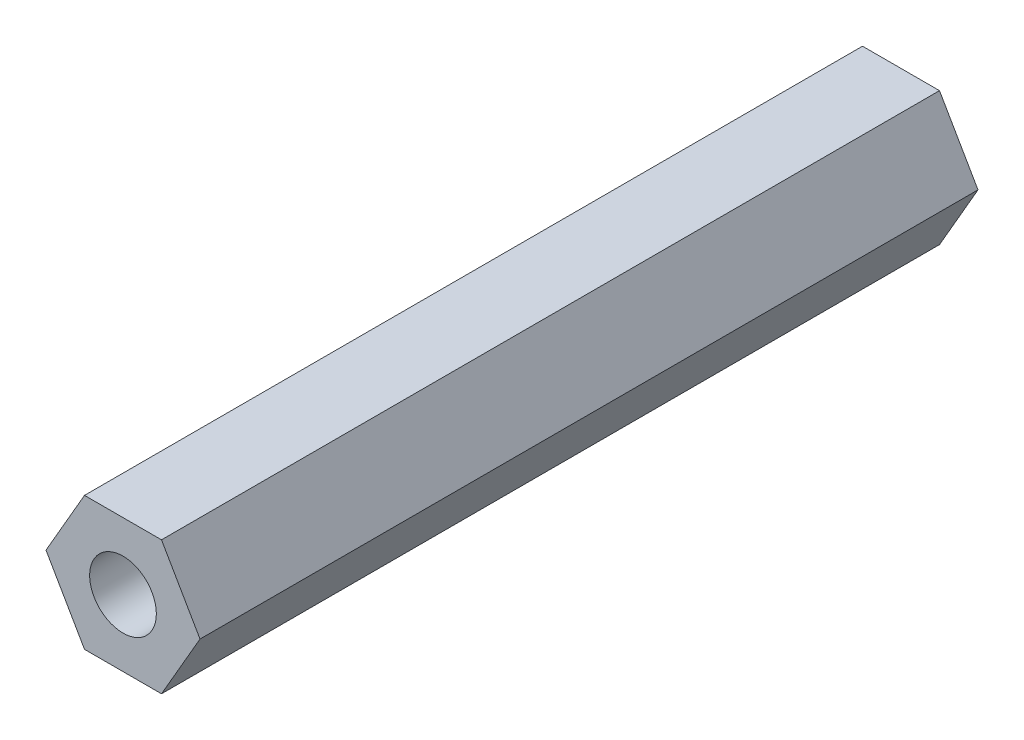
ISO-10303-21;
HEADER;
FILE_DESCRIPTION(('STEP AP214'),'2;1');
FILE_NAME('part.step','',(''),(''),'','','');
FILE_SCHEMA(('AUTOMOTIVE_DESIGN { 1 0 10303 214 1 1 1 1 }'));
ENDSEC;
DATA;
#1=APPLICATION_CONTEXT('core data for automotive mechanical design processes');
#2=APPLICATION_PROTOCOL_DEFINITION('international standard','automotive_design',2000,#1);
#3=PRODUCT_CONTEXT('',#1,'mechanical');
#4=PRODUCT('Part','Part','',(#3));
#5=PRODUCT_RELATED_PRODUCT_CATEGORY('part','',(#4));
#6=PRODUCT_DEFINITION_FORMATION('','',#4);
#7=PRODUCT_DEFINITION_CONTEXT('part definition',#1,'design');
#8=PRODUCT_DEFINITION('design','',#6,#7);
#9=PRODUCT_DEFINITION_SHAPE('','',#8);
#10=(LENGTH_UNIT() NAMED_UNIT(*) SI_UNIT(.MILLI.,.METRE.));
#11=(NAMED_UNIT(*) PLANE_ANGLE_UNIT() SI_UNIT($,.RADIAN.));
#12=(NAMED_UNIT(*) SI_UNIT($,.STERADIAN.) SOLID_ANGLE_UNIT());
#13=UNCERTAINTY_MEASURE_WITH_UNIT(LENGTH_MEASURE(1.E-05),#10,'distance_accuracy_value','');
#14=(GEOMETRIC_REPRESENTATION_CONTEXT(3) GLOBAL_UNCERTAINTY_ASSIGNED_CONTEXT((#13)) GLOBAL_UNIT_ASSIGNED_CONTEXT((#10,
#11,#12)) REPRESENTATION_CONTEXT('',''));
#15=CARTESIAN_POINT('',(0.,0.,0.));
#16=DIRECTION('',(0.,0.,1.));
#17=DIRECTION('',(1.,0.,0.));
#18=AXIS2_PLACEMENT_3D('',#15,#16,#17);
#19=CARTESIAN_POINT('',(-1.73205080756888,-3.,35.));
#20=DIRECTION('',(0.866025403784439,-0.5,0.));
#21=DIRECTION('',(0.5,0.866025403784439,0.));
#22=AXIS2_PLACEMENT_3D('',#19,#20,#21);
#23=PLANE('',#22);
#24=DIRECTION('',(-0.5,-0.866025403784439,0.));
#25=VECTOR('',#24,1.);
#26=CARTESIAN_POINT('',(-1.73205080756888,-3.,0.));
#27=LINE('',#26,#25);
#28=CARTESIAN_POINT('',(0.,0.,0.));
#29=VERTEX_POINT('',#28);
#30=CARTESIAN_POINT('',(-1.73205080756888,-3.,0.));
#31=VERTEX_POINT('',#30);
#32=EDGE_CURVE('E118',#29,#31,#27,.T.);
#33=ORIENTED_EDGE('',*,*,#32,.T.);
#34=DIRECTION('',(0.,0.,-1.));
#35=VECTOR('',#34,1.);
#36=CARTESIAN_POINT('',(-1.73205080756888,-3.,35.));
#37=LINE('',#36,#35);
#38=CARTESIAN_POINT('',(-1.73205080756888,-3.,35.));
#39=VERTEX_POINT('',#38);
#40=EDGE_CURVE('E11',#39,#31,#37,.T.);
#41=ORIENTED_EDGE('',*,*,#40,.F.);
#42=DIRECTION('',(-0.5,-0.866025403784439,0.));
#43=VECTOR('',#42,1.);
#44=CARTESIAN_POINT('',(-1.73205080756888,-3.,35.));
#45=LINE('',#44,#43);
#46=CARTESIAN_POINT('',(0.,0.,35.));
#47=VERTEX_POINT('',#46);
#48=EDGE_CURVE('E129',#47,#39,#45,.T.);
#49=ORIENTED_EDGE('',*,*,#48,.F.);
#50=DIRECTION('',(0.,0.,-1.));
#51=VECTOR('',#50,1.);
#52=CARTESIAN_POINT('',(0.,0.,35.));
#53=LINE('',#52,#51);
#54=EDGE_CURVE('E114',#47,#29,#53,.T.);
#55=ORIENTED_EDGE('',*,*,#54,.T.);
#56=EDGE_LOOP('',(#33,#41,#49,#55));
#57=FACE_BOUND('',#56,.T.);
#58=ADVANCED_FACE('F34',(#57),#23,.F.);
#59=CARTESIAN_POINT('',(0.,-6.,35.));
#60=DIRECTION('',(0.866025403784439,0.5,0.));
#61=DIRECTION('',(-0.5,0.866025403784439,0.));
#62=AXIS2_PLACEMENT_3D('',#59,#60,#61);
#63=PLANE('',#62);
#64=DIRECTION('',(0.5,-0.866025403784439,0.));
#65=VECTOR('',#64,1.);
#66=CARTESIAN_POINT('',(0.,-6.,0.));
#67=LINE('',#66,#65);
#68=CARTESIAN_POINT('',(0.,-6.,0.));
#69=VERTEX_POINT('',#68);
#70=EDGE_CURVE('E121',#31,#69,#67,.T.);
#71=ORIENTED_EDGE('',*,*,#70,.T.);
#72=DIRECTION('',(0.,0.,-1.));
#73=VECTOR('',#72,1.);
#74=CARTESIAN_POINT('',(0.,-6.,35.));
#75=LINE('',#74,#73);
#76=CARTESIAN_POINT('',(0.,-6.,35.));
#77=VERTEX_POINT('',#76);
#78=EDGE_CURVE('E42',#77,#69,#75,.T.);
#79=ORIENTED_EDGE('',*,*,#78,.F.);
#80=DIRECTION('',(0.5,-0.866025403784439,0.));
#81=VECTOR('',#80,1.);
#82=CARTESIAN_POINT('',(0.,-6.,35.));
#83=LINE('',#82,#81);
#84=EDGE_CURVE('E87',#39,#77,#83,.T.);
#85=ORIENTED_EDGE('',*,*,#84,.F.);
#86=ORIENTED_EDGE('',*,*,#40,.T.);
#87=EDGE_LOOP('',(#71,#79,#85,#86));
#88=FACE_BOUND('',#87,.T.);
#89=ADVANCED_FACE('F154',(#88),#63,.F.);
#90=CARTESIAN_POINT('',(3.46410161513775,-6.,35.));
#91=DIRECTION('',(0.,1.,0.));
#92=DIRECTION('',(0.,0.,1.));
#93=AXIS2_PLACEMENT_3D('',#90,#91,#92);
#94=PLANE('',#93);
#95=DIRECTION('',(1.,0.,0.));
#96=VECTOR('',#95,1.);
#97=CARTESIAN_POINT('',(3.46410161513775,-6.,0.));
#98=LINE('',#97,#96);
#99=CARTESIAN_POINT('',(3.46410161513775,-6.,0.));
#100=VERTEX_POINT('',#99);
#101=EDGE_CURVE('E124',#69,#100,#98,.T.);
#102=ORIENTED_EDGE('',*,*,#101,.T.);
#103=DIRECTION('',(0.,0.,-1.));
#104=VECTOR('',#103,1.);
#105=CARTESIAN_POINT('',(3.46410161513775,-6.,35.));
#106=LINE('',#105,#104);
#107=CARTESIAN_POINT('',(3.46410161513775,-6.,35.));
#108=VERTEX_POINT('',#107);
#109=EDGE_CURVE('E109',#108,#100,#106,.T.);
#110=ORIENTED_EDGE('',*,*,#109,.F.);
#111=DIRECTION('',(1.,0.,0.));
#112=VECTOR('',#111,1.);
#113=CARTESIAN_POINT('',(3.46410161513775,-6.,35.));
#114=LINE('',#113,#112);
#115=EDGE_CURVE('E100',#77,#108,#114,.T.);
#116=ORIENTED_EDGE('',*,*,#115,.F.);
#117=ORIENTED_EDGE('',*,*,#78,.T.);
#118=EDGE_LOOP('',(#102,#110,#116,#117));
#119=FACE_BOUND('',#118,.T.);
#120=ADVANCED_FACE('F135',(#119),#94,.F.);
#121=CARTESIAN_POINT('',(5.19615242270663,-3.,35.));
#122=DIRECTION('',(-0.866025403784439,0.5,0.));
#123=DIRECTION('',(-0.5,-0.866025403784439,0.));
#124=AXIS2_PLACEMENT_3D('',#121,#122,#123);
#125=PLANE('',#124);
#126=DIRECTION('',(0.5,0.866025403784439,0.));
#127=VECTOR('',#126,1.);
#128=CARTESIAN_POINT('',(5.19615242270663,-3.,0.));
#129=LINE('',#128,#127);
#130=CARTESIAN_POINT('',(5.19615242270663,-3.,0.));
#131=VERTEX_POINT('',#130);
#132=EDGE_CURVE('E108',#100,#131,#129,.T.);
#133=ORIENTED_EDGE('',*,*,#132,.T.);
#134=DIRECTION('',(0.,0.,-1.));
#135=VECTOR('',#134,1.);
#136=CARTESIAN_POINT('',(5.19615242270663,-3.,35.));
#137=LINE('',#136,#135);
#138=CARTESIAN_POINT('',(5.19615242270663,-3.,35.));
#139=VERTEX_POINT('',#138);
#140=EDGE_CURVE('E105',#139,#131,#137,.T.);
#141=ORIENTED_EDGE('',*,*,#140,.F.);
#142=DIRECTION('',(0.5,0.866025403784439,0.));
#143=VECTOR('',#142,1.);
#144=CARTESIAN_POINT('',(5.19615242270663,-3.,35.));
#145=LINE('',#144,#143);
#146=EDGE_CURVE('E94',#108,#139,#145,.T.);
#147=ORIENTED_EDGE('',*,*,#146,.F.);
#148=ORIENTED_EDGE('',*,*,#109,.T.);
#149=EDGE_LOOP('',(#133,#141,#147,#148));
#150=FACE_BOUND('',#149,.T.);
#151=ADVANCED_FACE('F106',(#150),#125,.F.);
#152=CARTESIAN_POINT('',(3.46410161513775,0.,35.));
#153=DIRECTION('',(-0.866025403784439,-0.5,0.));
#154=DIRECTION('',(0.5,-0.866025403784439,0.));
#155=AXIS2_PLACEMENT_3D('',#152,#153,#154);
#156=PLANE('',#155);
#157=DIRECTION('',(-0.5,0.866025403784439,0.));
#158=VECTOR('',#157,1.);
#159=CARTESIAN_POINT('',(3.46410161513775,0.,0.));
#160=LINE('',#159,#158);
#161=CARTESIAN_POINT('',(3.46410161513775,0.,0.));
#162=VERTEX_POINT('',#161);
#163=EDGE_CURVE('E73',#131,#162,#160,.T.);
#164=ORIENTED_EDGE('',*,*,#163,.T.);
#165=DIRECTION('',(0.,0.,-1.));
#166=VECTOR('',#165,1.);
#167=CARTESIAN_POINT('',(3.46410161513775,0.,35.));
#168=LINE('',#167,#166);
#169=CARTESIAN_POINT('',(3.46410161513775,0.,35.));
#170=VERTEX_POINT('',#169);
#171=EDGE_CURVE('E110',#170,#162,#168,.T.);
#172=ORIENTED_EDGE('',*,*,#171,.F.);
#173=DIRECTION('',(-0.5,0.866025403784439,0.));
#174=VECTOR('',#173,1.);
#175=CARTESIAN_POINT('',(3.46410161513775,0.,35.));
#176=LINE('',#175,#174);
#177=EDGE_CURVE('E98',#139,#170,#176,.T.);
#178=ORIENTED_EDGE('',*,*,#177,.F.);
#179=ORIENTED_EDGE('',*,*,#140,.T.);
#180=EDGE_LOOP('',(#164,#172,#178,#179));
#181=FACE_BOUND('',#180,.T.);
#182=ADVANCED_FACE('F112',(#181),#156,.F.);
#183=CARTESIAN_POINT('',(0.,0.,35.));
#184=DIRECTION('',(0.,-1.,0.));
#185=DIRECTION('',(1.,0.,0.));
#186=AXIS2_PLACEMENT_3D('',#183,#184,#185);
#187=PLANE('',#186);
#188=DIRECTION('',(-1.,0.,0.));
#189=VECTOR('',#188,1.);
#190=CARTESIAN_POINT('',(0.,0.,0.));
#191=LINE('',#190,#189);
#192=EDGE_CURVE('E79',#162,#29,#191,.T.);
#193=ORIENTED_EDGE('',*,*,#192,.T.);
#194=ORIENTED_EDGE('',*,*,#54,.F.);
#195=DIRECTION('',(-1.,0.,0.));
#196=VECTOR('',#195,1.);
#197=CARTESIAN_POINT('',(0.,0.,35.));
#198=LINE('',#197,#196);
#199=EDGE_CURVE('E50',#170,#47,#198,.T.);
#200=ORIENTED_EDGE('',*,*,#199,.F.);
#201=ORIENTED_EDGE('',*,*,#171,.T.);
#202=EDGE_LOOP('',(#193,#194,#200,#201));
#203=FACE_BOUND('',#202,.T.);
#204=ADVANCED_FACE('F142',(#203),#187,.F.);
#205=CARTESIAN_POINT('',(0.,0.,35.));
#206=DIRECTION('',(0.,0.,-1.));
#207=DIRECTION('',(-1.,0.,0.));
#208=AXIS2_PLACEMENT_3D('',#205,#206,#207);
#209=PLANE('',#208);
#210=CARTESIAN_POINT('',(1.73205080756888,-3.,35.));
#211=DIRECTION('',(0.,0.,1.));
#212=DIRECTION('',(1.,0.,0.));
#213=AXIS2_PLACEMENT_3D('',#210,#211,#212);
#214=CIRCLE('',#213,1.5);
#215=CARTESIAN_POINT('',(3.23205080756888,-3.,35.));
#216=VERTEX_POINT('',#215);
#217=EDGE_CURVE('E209',#216,#216,#214,.T.);
#218=ORIENTED_EDGE('',*,*,#217,.F.);
#219=EDGE_LOOP('',(#218));
#220=FACE_BOUND('',#219,.T.);
#221=ORIENTED_EDGE('',*,*,#48,.T.);
#222=ORIENTED_EDGE('',*,*,#84,.T.);
#223=ORIENTED_EDGE('',*,*,#115,.T.);
#224=ORIENTED_EDGE('',*,*,#146,.T.);
#225=ORIENTED_EDGE('',*,*,#177,.T.);
#226=ORIENTED_EDGE('',*,*,#199,.T.);
#227=EDGE_LOOP('',(#221,#222,#223,#224,#225,#226));
#228=FACE_BOUND('',#227,.T.);
#229=ADVANCED_FACE('F96',(#220,#228),#209,.F.);
#230=CARTESIAN_POINT('',(0.,0.,0.));
#231=DIRECTION('',(0.,0.,-1.));
#232=DIRECTION('',(-1.,0.,0.));
#233=AXIS2_PLACEMENT_3D('',#230,#231,#232);
#234=PLANE('',#233);
#235=CARTESIAN_POINT('',(1.73205080756888,-3.,0.));
#236=DIRECTION('',(0.,0.,1.));
#237=DIRECTION('',(1.,0.,0.));
#238=AXIS2_PLACEMENT_3D('',#235,#236,#237);
#239=CIRCLE('',#238,1.5);
#240=CARTESIAN_POINT('',(3.23205080756888,-3.,0.));
#241=VERTEX_POINT('',#240);
#242=EDGE_CURVE('E122',#241,#241,#239,.T.);
#243=ORIENTED_EDGE('',*,*,#242,.T.);
#244=EDGE_LOOP('',(#243));
#245=FACE_BOUND('',#244,.T.);
#246=ORIENTED_EDGE('',*,*,#32,.F.);
#247=ORIENTED_EDGE('',*,*,#192,.F.);
#248=ORIENTED_EDGE('',*,*,#163,.F.);
#249=ORIENTED_EDGE('',*,*,#132,.F.);
#250=ORIENTED_EDGE('',*,*,#101,.F.);
#251=ORIENTED_EDGE('',*,*,#70,.F.);
#252=EDGE_LOOP('',(#246,#247,#248,#249,#250,#251));
#253=FACE_BOUND('',#252,.T.);
#254=ADVANCED_FACE('F138',(#245,#253),#234,.T.);
#255=CARTESIAN_POINT('',(1.73205080756888,-3.,0.));
#256=DIRECTION('',(0.,0.,1.));
#257=DIRECTION('',(1.,0.,0.));
#258=AXIS2_PLACEMENT_3D('',#255,#256,#257);
#259=CYLINDRICAL_SURFACE('',#258,1.5);
#260=ORIENTED_EDGE('',*,*,#242,.F.);
#261=EDGE_LOOP('',(#260));
#262=FACE_BOUND('',#261,.T.);
#263=ORIENTED_EDGE('',*,*,#217,.T.);
#264=EDGE_LOOP('',(#263));
#265=FACE_BOUND('',#264,.T.);
#266=ADVANCED_FACE('F191',(#262,#265),#259,.F.);
#267=CLOSED_SHELL('',(#58,#89,#120,#151,#182,#204,#229,#254,#266));
#268=MANIFOLD_SOLID_BREP('B2',#267);
#269=ADVANCED_BREP_SHAPE_REPRESENTATION('',(#18,#268),#14);
#270=SHAPE_DEFINITION_REPRESENTATION(#9,#269);
ENDSEC;
END-ISO-10303-21;
